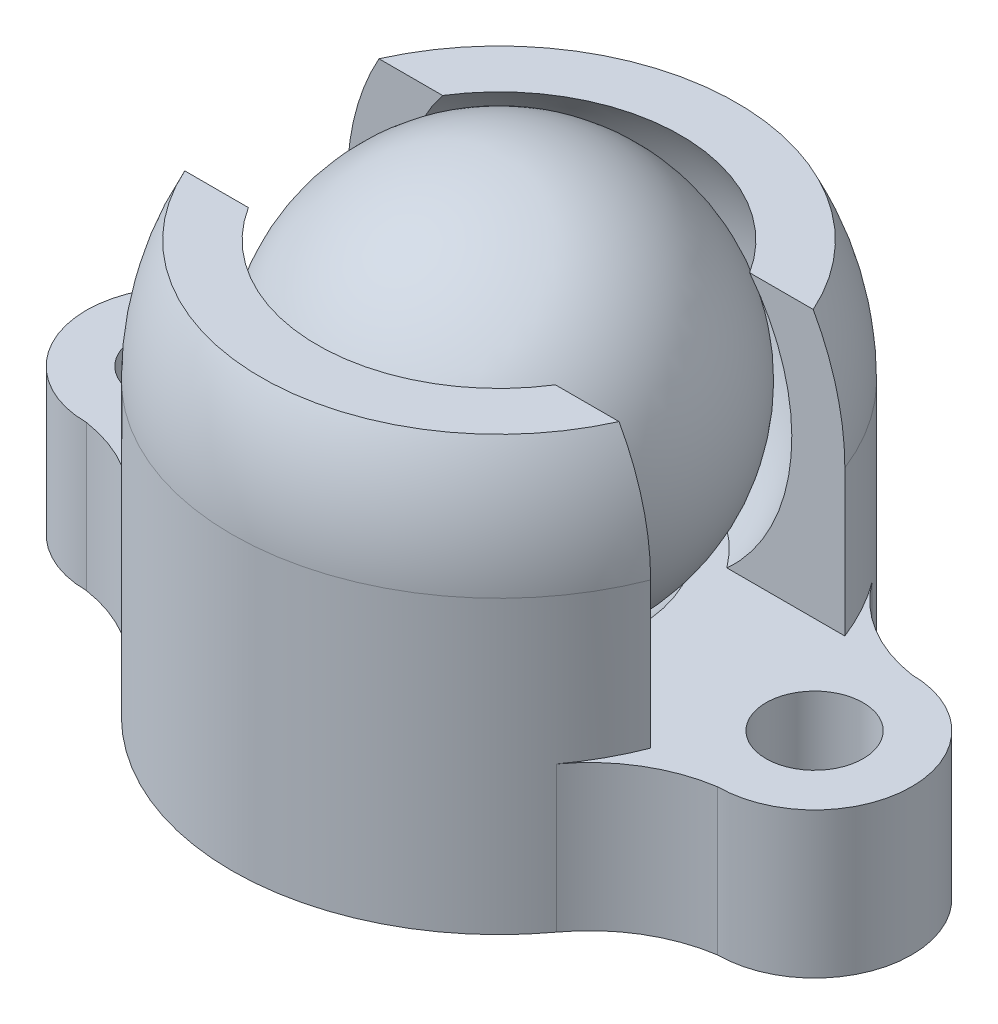
ISO-10303-21;
HEADER;
FILE_DESCRIPTION(('STEP AP214'),'2;1');
FILE_NAME('part.step','',(''),(''),'','','');
FILE_SCHEMA(('AUTOMOTIVE_DESIGN { 1 0 10303 214 1 1 1 1 }'));
ENDSEC;
DATA;
#1=APPLICATION_CONTEXT('core data for automotive mechanical design processes');
#2=APPLICATION_PROTOCOL_DEFINITION('international standard','automotive_design',2000,#1);
#3=PRODUCT_CONTEXT('',#1,'mechanical');
#4=PRODUCT('Part','Part','',(#3));
#5=PRODUCT_RELATED_PRODUCT_CATEGORY('part','',(#4));
#6=PRODUCT_DEFINITION_FORMATION('','',#4);
#7=PRODUCT_DEFINITION_CONTEXT('part definition',#1,'design');
#8=PRODUCT_DEFINITION('design','',#6,#7);
#9=PRODUCT_DEFINITION_SHAPE('','',#8);
#10=(LENGTH_UNIT() NAMED_UNIT(*) SI_UNIT(.MILLI.,.METRE.));
#11=(NAMED_UNIT(*) PLANE_ANGLE_UNIT() SI_UNIT($,.RADIAN.));
#12=(NAMED_UNIT(*) SI_UNIT($,.STERADIAN.) SOLID_ANGLE_UNIT());
#13=UNCERTAINTY_MEASURE_WITH_UNIT(LENGTH_MEASURE(1.E-05),#10,'distance_accuracy_value','');
#14=(GEOMETRIC_REPRESENTATION_CONTEXT(3) GLOBAL_UNCERTAINTY_ASSIGNED_CONTEXT((#13)) GLOBAL_UNIT_ASSIGNED_CONTEXT((#10,
#11,#12)) REPRESENTATION_CONTEXT('',''));
#15=CARTESIAN_POINT('',(0.,0.,0.));
#16=DIRECTION('',(0.,0.,1.));
#17=DIRECTION('',(1.,0.,0.));
#18=AXIS2_PLACEMENT_3D('',#15,#16,#17);
#19=CARTESIAN_POINT('',(0.,6.,0.));
#20=DIRECTION('',(0.,1.,0.));
#21=DIRECTION('',(0.,0.,-1.));
#22=AXIS2_PLACEMENT_3D('',#19,#20,#21);
#23=SPHERICAL_SURFACE('',#22,4.);
#24=CARTESIAN_POINT('',(0.,10.,0.));
#25=VERTEX_POINT('',#24);
#26=VERTEX_LOOP('',#25);
#27=FACE_BOUND('',#26,.T.);
#28=ADVANCED_FACE('F44',(#27),#23,.T.);
#29=CLOSED_SHELL('',(#28));
#30=MANIFOLD_SOLID_BREP('B2',#29);
#31=CARTESIAN_POINT('',(0.,6.,0.));
#32=DIRECTION('',(0.,1.,0.));
#33=DIRECTION('',(0.,0.,-1.));
#34=AXIS2_PLACEMENT_3D('',#31,#32,#33);
#35=SPHERICAL_SURFACE('',#34,4.5);
#36=CARTESIAN_POINT('',(0.,3.,0.));
#37=DIRECTION('',(0.,1.,0.));
#38=DIRECTION('',(0.,0.,1.));
#39=AXIS2_PLACEMENT_3D('',#36,#37,#38);
#40=CIRCLE('',#39,3.35410196624968);
#41=CARTESIAN_POINT('',(-2.69258240356725,3.,2.));
#42=VERTEX_POINT('',#41);
#43=CARTESIAN_POINT('',(2.69258240356725,3.,2.));
#44=VERTEX_POINT('',#43);
#45=EDGE_CURVE('E205',#42,#44,#40,.T.);
#46=ORIENTED_EDGE('',*,*,#45,.F.);
#47=CARTESIAN_POINT('',(0.,6.,2.));
#48=DIRECTION('',(0.,0.,1.));
#49=DIRECTION('',(1.,0.,0.));
#50=AXIS2_PLACEMENT_3D('',#47,#48,#49);
#51=CIRCLE('',#50,4.03112887414927);
#52=CARTESIAN_POINT('',(-3.16227766016838,8.5,2.));
#53=VERTEX_POINT('',#52);
#54=EDGE_CURVE('E314',#42,#53,#51,.F.);
#55=ORIENTED_EDGE('',*,*,#54,.T.);
#56=CARTESIAN_POINT('',(0.,8.5,0.));
#57=DIRECTION('',(0.,1.,0.));
#58=DIRECTION('',(0.,0.,1.));
#59=AXIS2_PLACEMENT_3D('',#56,#57,#58);
#60=CIRCLE('',#59,3.74165738677394);
#61=CARTESIAN_POINT('',(3.16227766016838,8.5,2.));
#62=VERTEX_POINT('',#61);
#63=EDGE_CURVE('E311',#53,#62,#60,.T.);
#64=ORIENTED_EDGE('',*,*,#63,.T.);
#65=EDGE_CURVE('E315',#62,#44,#51,.F.);
#66=ORIENTED_EDGE('',*,*,#65,.T.);
#67=EDGE_LOOP('',(#46,#55,#64,#66));
#68=FACE_BOUND('',#67,.T.);
#69=ADVANCED_FACE('F56',(#68),#35,.F.);
#70=CARTESIAN_POINT('',(0.,6.,0.));
#71=DIRECTION('',(0.,1.,0.));
#72=DIRECTION('',(0.,0.,-1.));
#73=AXIS2_PLACEMENT_3D('',#70,#71,#72);
#74=SPHERICAL_SURFACE('',#73,5.5);
#75=CARTESIAN_POINT('',(0.,6.,0.));
#76=DIRECTION('',(0.,1.,0.));
#77=DIRECTION('',(0.,0.,1.));
#78=AXIS2_PLACEMENT_3D('',#75,#76,#77);
#79=CIRCLE('',#78,5.5);
#80=CARTESIAN_POINT('',(-5.1234753829798,6.,2.));
#81=VERTEX_POINT('',#80);
#82=CARTESIAN_POINT('',(5.1234753829798,6.,2.));
#83=VERTEX_POINT('',#82);
#84=EDGE_CURVE('E293',#81,#83,#79,.T.);
#85=ORIENTED_EDGE('',*,*,#84,.T.);
#86=CARTESIAN_POINT('',(0.,6.,2.));
#87=DIRECTION('',(0.,0.,1.));
#88=DIRECTION('',(1.,0.,0.));
#89=AXIS2_PLACEMENT_3D('',#86,#87,#88);
#90=CIRCLE('',#89,5.1234753829798);
#91=CARTESIAN_POINT('',(4.47213595499958,8.5,2.));
#92=VERTEX_POINT('',#91);
#93=EDGE_CURVE('E301',#83,#92,#90,.T.);
#94=ORIENTED_EDGE('',*,*,#93,.T.);
#95=CARTESIAN_POINT('',(0.,8.5,0.));
#96=DIRECTION('',(0.,1.,0.));
#97=DIRECTION('',(0.,0.,1.));
#98=AXIS2_PLACEMENT_3D('',#95,#96,#97);
#99=CIRCLE('',#98,4.89897948556636);
#100=CARTESIAN_POINT('',(-4.47213595499958,8.5,2.));
#101=VERTEX_POINT('',#100);
#102=EDGE_CURVE('E308',#101,#92,#99,.T.);
#103=ORIENTED_EDGE('',*,*,#102,.F.);
#104=EDGE_CURVE('E303',#101,#81,#90,.T.);
#105=ORIENTED_EDGE('',*,*,#104,.T.);
#106=EDGE_LOOP('',(#85,#94,#103,#105));
#107=FACE_BOUND('',#106,.T.);
#108=ADVANCED_FACE('F299',(#107),#74,.T.);
#109=CARTESIAN_POINT('',(0.,8.5,-3.74165738677394));
#110=DIRECTION('',(0.,-1.,0.));
#111=DIRECTION('',(0.,0.,-1.));
#112=AXIS2_PLACEMENT_3D('',#109,#110,#111);
#113=PLANE('',#112);
#114=ORIENTED_EDGE('',*,*,#102,.T.);
#115=DIRECTION('',(1.,0.,0.));
#116=VECTOR('',#115,1.);
#117=CARTESIAN_POINT('',(-8.5,8.5,2.));
#118=LINE('',#117,#116);
#119=EDGE_CURVE('E328',#62,#92,#118,.T.);
#120=ORIENTED_EDGE('',*,*,#119,.F.);
#121=ORIENTED_EDGE('',*,*,#63,.F.);
#122=EDGE_CURVE('E322',#101,#53,#118,.T.);
#123=ORIENTED_EDGE('',*,*,#122,.F.);
#124=EDGE_LOOP('',(#114,#120,#121,#123));
#125=FACE_BOUND('',#124,.T.);
#126=ADVANCED_FACE('F381',(#125),#113,.F.);
#127=CARTESIAN_POINT('',(0.,3.,0.));
#128=DIRECTION('',(0.,-1.,0.));
#129=DIRECTION('',(0.,0.,-1.));
#130=AXIS2_PLACEMENT_3D('',#127,#128,#129);
#131=CYLINDRICAL_SURFACE('',#130,5.5);
#132=ORIENTED_EDGE('',*,*,#84,.F.);
#133=DIRECTION('',(0.,-1.,0.));
#134=VECTOR('',#133,1.);
#135=CARTESIAN_POINT('',(-5.1234753829798,3.,2.));
#136=LINE('',#135,#134);
#137=CARTESIAN_POINT('',(-5.1234753829798,3.,2.));
#138=VERTEX_POINT('',#137);
#139=EDGE_CURVE('E42',#81,#138,#136,.T.);
#140=ORIENTED_EDGE('',*,*,#139,.T.);
#141=CARTESIAN_POINT('',(0.,3.,0.));
#142=DIRECTION('',(0.,1.,0.));
#143=DIRECTION('',(0.,0.,1.));
#144=AXIS2_PLACEMENT_3D('',#141,#142,#143);
#145=CIRCLE('',#144,5.5);
#146=CARTESIAN_POINT('',(-4.43705983732471,3.,3.25));
#147=VERTEX_POINT('',#146);
#148=EDGE_CURVE('E280',#147,#138,#145,.F.);
#149=ORIENTED_EDGE('',*,*,#148,.F.);
#150=DIRECTION('',(0.,-1.,0.));
#151=VECTOR('',#150,1.);
#152=CARTESIAN_POINT('',(-4.43705983732471,3.,3.25));
#153=LINE('',#152,#151);
#154=CARTESIAN_POINT('',(-4.43705983732471,0.,3.25));
#155=VERTEX_POINT('',#154);
#156=EDGE_CURVE('E266',#147,#155,#153,.T.);
#157=ORIENTED_EDGE('',*,*,#156,.T.);
#158=CARTESIAN_POINT('',(0.,0.,0.));
#159=DIRECTION('',(0.,1.,0.));
#160=DIRECTION('',(0.,0.,1.));
#161=AXIS2_PLACEMENT_3D('',#158,#159,#160);
#162=CIRCLE('',#161,5.5);
#163=CARTESIAN_POINT('',(4.43705983732471,0.,3.25));
#164=VERTEX_POINT('',#163);
#165=EDGE_CURVE('E253',#155,#164,#162,.T.);
#166=ORIENTED_EDGE('',*,*,#165,.T.);
#167=DIRECTION('',(0.,-1.,0.));
#168=VECTOR('',#167,1.);
#169=CARTESIAN_POINT('',(4.43705983732471,3.,3.25));
#170=LINE('',#169,#168);
#171=CARTESIAN_POINT('',(4.43705983732471,3.,3.25));
#172=VERTEX_POINT('',#171);
#173=EDGE_CURVE('E264',#172,#164,#170,.T.);
#174=ORIENTED_EDGE('',*,*,#173,.F.);
#175=CARTESIAN_POINT('',(0.,3.,0.));
#176=DIRECTION('',(0.,1.,0.));
#177=DIRECTION('',(0.,0.,1.));
#178=AXIS2_PLACEMENT_3D('',#175,#176,#177);
#179=CIRCLE('',#178,5.5);
#180=CARTESIAN_POINT('',(5.1234753829798,3.,2.));
#181=VERTEX_POINT('',#180);
#182=EDGE_CURVE('E210',#172,#181,#179,.T.);
#183=ORIENTED_EDGE('',*,*,#182,.T.);
#184=DIRECTION('',(0.,-1.,0.));
#185=VECTOR('',#184,1.);
#186=CARTESIAN_POINT('',(5.1234753829798,3.,2.));
#187=LINE('',#186,#185);
#188=EDGE_CURVE('E64',#181,#83,#187,.F.);
#189=ORIENTED_EDGE('',*,*,#188,.T.);
#190=EDGE_LOOP('',(#132,#140,#149,#157,#166,#174,#183,#189));
#191=FACE_BOUND('',#190,.T.);
#192=ADVANCED_FACE('F292',(#191),#131,.T.);
#193=CARTESIAN_POINT('',(0.,6.5,0.));
#194=DIRECTION('',(0.,-1.,0.));
#195=DIRECTION('',(-1.,0.,0.));
#196=AXIS2_PLACEMENT_3D('',#193,#194,#195);
#197=SPHERICAL_SURFACE('',#196,4.5);
#198=CARTESIAN_POINT('',(0.,3.,0.));
#199=DIRECTION('',(0.,1.,0.));
#200=DIRECTION('',(0.,0.,1.));
#201=AXIS2_PLACEMENT_3D('',#198,#199,#200);
#202=CIRCLE('',#201,2.82842712474619);
#203=CARTESIAN_POINT('',(0.,3.,2.82842712474619));
#204=VERTEX_POINT('',#203);
#205=EDGE_CURVE('E204',#204,#204,#202,.T.);
#206=ORIENTED_EDGE('',*,*,#205,.T.);
#207=EDGE_LOOP('',(#206));
#208=FACE_BOUND('',#207,.T.);
#209=ADVANCED_FACE('F401',(#208),#197,.F.);
#210=CARTESIAN_POINT('',(2.69258240356725,3.,-2.));
#211=VERTEX_POINT('',#210);
#212=CARTESIAN_POINT('',(-2.69258240356725,3.,-2.));
#213=VERTEX_POINT('',#212);
#214=EDGE_CURVE('E194',#211,#213,#40,.T.);
#215=ORIENTED_EDGE('',*,*,#214,.F.);
#216=CARTESIAN_POINT('',(0.,6.,-2.));
#217=DIRECTION('',(0.,0.,-1.));
#218=DIRECTION('',(-1.,0.,0.));
#219=AXIS2_PLACEMENT_3D('',#216,#217,#218);
#220=CIRCLE('',#219,4.03112887414927);
#221=CARTESIAN_POINT('',(3.16227766016838,8.5,-2.));
#222=VERTEX_POINT('',#221);
#223=EDGE_CURVE('E197',#211,#222,#220,.F.);
#224=ORIENTED_EDGE('',*,*,#223,.T.);
#225=CARTESIAN_POINT('',(-3.16227766016838,8.5,-2.));
#226=VERTEX_POINT('',#225);
#227=EDGE_CURVE('E196',#222,#226,#60,.T.);
#228=ORIENTED_EDGE('',*,*,#227,.T.);
#229=EDGE_CURVE('E181',#226,#213,#220,.F.);
#230=ORIENTED_EDGE('',*,*,#229,.T.);
#231=EDGE_LOOP('',(#215,#224,#228,#230));
#232=FACE_BOUND('',#231,.T.);
#233=ADVANCED_FACE('F192',(#232),#35,.F.);
#234=CARTESIAN_POINT('',(5.1234753829798,6.,-2.));
#235=VERTEX_POINT('',#234);
#236=CARTESIAN_POINT('',(-5.1234753829798,6.,-2.));
#237=VERTEX_POINT('',#236);
#238=EDGE_CURVE('E304',#235,#237,#79,.T.);
#239=ORIENTED_EDGE('',*,*,#238,.T.);
#240=CARTESIAN_POINT('',(0.,6.,-2.));
#241=DIRECTION('',(0.,0.,-1.));
#242=DIRECTION('',(-1.,0.,0.));
#243=AXIS2_PLACEMENT_3D('',#240,#241,#242);
#244=CIRCLE('',#243,5.1234753829798);
#245=CARTESIAN_POINT('',(-4.47213595499958,8.5,-2.));
#246=VERTEX_POINT('',#245);
#247=EDGE_CURVE('E319',#237,#246,#244,.T.);
#248=ORIENTED_EDGE('',*,*,#247,.T.);
#249=CARTESIAN_POINT('',(4.47213595499958,8.5,-2.));
#250=VERTEX_POINT('',#249);
#251=EDGE_CURVE('E305',#250,#246,#99,.T.);
#252=ORIENTED_EDGE('',*,*,#251,.F.);
#253=EDGE_CURVE('E198',#250,#235,#244,.T.);
#254=ORIENTED_EDGE('',*,*,#253,.T.);
#255=EDGE_LOOP('',(#239,#248,#252,#254));
#256=FACE_BOUND('',#255,.T.);
#257=ADVANCED_FACE('F334',(#256),#74,.T.);
#258=ORIENTED_EDGE('',*,*,#251,.T.);
#259=DIRECTION('',(1.,0.,0.));
#260=VECTOR('',#259,1.);
#261=CARTESIAN_POINT('',(-8.5,8.5,-2.));
#262=LINE('',#261,#260);
#263=EDGE_CURVE('E327',#246,#226,#262,.T.);
#264=ORIENTED_EDGE('',*,*,#263,.T.);
#265=ORIENTED_EDGE('',*,*,#227,.F.);
#266=EDGE_CURVE('E186',#222,#250,#262,.T.);
#267=ORIENTED_EDGE('',*,*,#266,.T.);
#268=EDGE_LOOP('',(#258,#264,#265,#267));
#269=FACE_BOUND('',#268,.T.);
#270=ADVANCED_FACE('F331',(#269),#113,.F.);
#271=CARTESIAN_POINT('',(-6.5,3.,0.));
#272=DIRECTION('',(0.,-1.,0.));
#273=DIRECTION('',(0.,0.,-1.));
#274=AXIS2_PLACEMENT_3D('',#271,#272,#273);
#275=CYLINDRICAL_SURFACE('',#274,2.);
#276=CARTESIAN_POINT('',(-6.5,0.,0.));
#277=DIRECTION('',(0.,1.,0.));
#278=DIRECTION('',(0.,0.,1.));
#279=AXIS2_PLACEMENT_3D('',#276,#277,#278);
#280=CIRCLE('',#279,2.);
#281=CARTESIAN_POINT('',(-6.5,0.,-2.));
#282=VERTEX_POINT('',#281);
#283=CARTESIAN_POINT('',(-6.5,0.,2.));
#284=VERTEX_POINT('',#283);
#285=EDGE_CURVE('E249',#282,#284,#280,.T.);
#286=ORIENTED_EDGE('',*,*,#285,.T.);
#287=DIRECTION('',(0.,-1.,0.));
#288=VECTOR('',#287,1.);
#289=CARTESIAN_POINT('',(-6.5,3.,2.));
#290=LINE('',#289,#288);
#291=CARTESIAN_POINT('',(-6.5,3.,2.));
#292=VERTEX_POINT('',#291);
#293=EDGE_CURVE('E269',#292,#284,#290,.T.);
#294=ORIENTED_EDGE('',*,*,#293,.F.);
#295=CARTESIAN_POINT('',(-6.5,3.,0.));
#296=DIRECTION('',(0.,1.,0.));
#297=DIRECTION('',(0.,0.,1.));
#298=AXIS2_PLACEMENT_3D('',#295,#296,#297);
#299=CIRCLE('',#298,2.);
#300=CARTESIAN_POINT('',(-6.5,3.,-2.));
#301=VERTEX_POINT('',#300);
#302=EDGE_CURVE('E226',#301,#292,#299,.T.);
#303=ORIENTED_EDGE('',*,*,#302,.F.);
#304=DIRECTION('',(0.,-1.,0.));
#305=VECTOR('',#304,1.);
#306=CARTESIAN_POINT('',(-6.5,3.,-2.));
#307=LINE('',#306,#305);
#308=EDGE_CURVE('E272',#301,#282,#307,.T.);
#309=ORIENTED_EDGE('',*,*,#308,.T.);
#310=EDGE_LOOP('',(#286,#294,#303,#309));
#311=FACE_BOUND('',#310,.T.);
#312=ADVANCED_FACE('F369',(#311),#275,.T.);
#313=CARTESIAN_POINT('',(-6.5,3.,0.));
#314=DIRECTION('',(0.,-1.,0.));
#315=DIRECTION('',(0.,0.,-1.));
#316=AXIS2_PLACEMENT_3D('',#313,#314,#315);
#317=CYLINDRICAL_SURFACE('',#316,1.);
#318=CARTESIAN_POINT('',(-6.5,3.,0.));
#319=DIRECTION('',(0.,1.,0.));
#320=DIRECTION('',(0.,0.,1.));
#321=AXIS2_PLACEMENT_3D('',#318,#319,#320);
#322=CIRCLE('',#321,1.);
#323=CARTESIAN_POINT('',(-6.5,3.,1.));
#324=VERTEX_POINT('',#323);
#325=EDGE_CURVE('E217',#324,#324,#322,.T.);
#326=ORIENTED_EDGE('',*,*,#325,.T.);
#327=EDGE_LOOP('',(#326));
#328=FACE_BOUND('',#327,.T.);
#329=CARTESIAN_POINT('',(-6.5,0.,0.));
#330=DIRECTION('',(0.,1.,0.));
#331=DIRECTION('',(0.,0.,1.));
#332=AXIS2_PLACEMENT_3D('',#329,#330,#331);
#333=CIRCLE('',#332,1.);
#334=CARTESIAN_POINT('',(-6.5,0.,1.));
#335=VERTEX_POINT('',#334);
#336=EDGE_CURVE('E237',#335,#335,#333,.T.);
#337=ORIENTED_EDGE('',*,*,#336,.F.);
#338=EDGE_LOOP('',(#337));
#339=FACE_BOUND('',#338,.T.);
#340=ADVANCED_FACE('F427',(#328,#339),#317,.F.);
#341=CARTESIAN_POINT('',(-6.97255019678251,3.,-5.10716306976971));
#342=DIRECTION('',(0.,-1.,0.));
#343=DIRECTION('',(0.,0.,-1.));
#344=AXIS2_PLACEMENT_3D('',#341,#342,#343);
#345=CYLINDRICAL_SURFACE('',#344,3.14289134884105);
#346=CARTESIAN_POINT('',(-6.97255019678251,0.,-5.10716306976971));
#347=DIRECTION('',(0.,1.,0.));
#348=DIRECTION('',(0.,0.,1.));
#349=AXIS2_PLACEMENT_3D('',#346,#347,#348);
#350=CIRCLE('',#349,3.14289134884105);
#351=CARTESIAN_POINT('',(-4.43705983732471,0.,-3.25));
#352=VERTEX_POINT('',#351);
#353=EDGE_CURVE('E246',#282,#352,#350,.T.);
#354=ORIENTED_EDGE('',*,*,#353,.F.);
#355=ORIENTED_EDGE('',*,*,#308,.F.);
#356=CARTESIAN_POINT('',(-6.97255019678251,3.,-5.10716306976971));
#357=DIRECTION('',(0.,1.,0.));
#358=DIRECTION('',(0.,0.,1.));
#359=AXIS2_PLACEMENT_3D('',#356,#357,#358);
#360=CIRCLE('',#359,3.14289134884105);
#361=CARTESIAN_POINT('',(-4.43705983732471,3.,-3.25));
#362=VERTEX_POINT('',#361);
#363=EDGE_CURVE('E223',#301,#362,#360,.T.);
#364=ORIENTED_EDGE('',*,*,#363,.T.);
#365=DIRECTION('',(0.,-1.,0.));
#366=VECTOR('',#365,1.);
#367=CARTESIAN_POINT('',(-4.43705983732471,3.,-3.25));
#368=LINE('',#367,#366);
#369=EDGE_CURVE('E274',#362,#352,#368,.T.);
#370=ORIENTED_EDGE('',*,*,#369,.T.);
#371=EDGE_LOOP('',(#354,#355,#364,#370));
#372=FACE_BOUND('',#371,.T.);
#373=ADVANCED_FACE('F372',(#372),#345,.F.);
#374=CARTESIAN_POINT('',(6.5,3.,0.));
#375=DIRECTION('',(0.,-1.,0.));
#376=DIRECTION('',(0.,0.,-1.));
#377=AXIS2_PLACEMENT_3D('',#374,#375,#376);
#378=CYLINDRICAL_SURFACE('',#377,2.);
#379=CARTESIAN_POINT('',(6.5,0.,0.));
#380=DIRECTION('',(0.,1.,0.));
#381=DIRECTION('',(0.,0.,1.));
#382=AXIS2_PLACEMENT_3D('',#379,#380,#381);
#383=CIRCLE('',#382,2.);
#384=CARTESIAN_POINT('',(6.5,0.,-2.));
#385=VERTEX_POINT('',#384);
#386=CARTESIAN_POINT('',(6.5,0.,2.));
#387=VERTEX_POINT('',#386);
#388=EDGE_CURVE('E218',#385,#387,#383,.F.);
#389=ORIENTED_EDGE('',*,*,#388,.F.);
#390=DIRECTION('',(0.,-1.,0.));
#391=VECTOR('',#390,1.);
#392=CARTESIAN_POINT('',(6.5,3.,-2.));
#393=LINE('',#392,#391);
#394=CARTESIAN_POINT('',(6.5,3.,-2.));
#395=VERTEX_POINT('',#394);
#396=EDGE_CURVE('E234',#395,#385,#393,.T.);
#397=ORIENTED_EDGE('',*,*,#396,.F.);
#398=CARTESIAN_POINT('',(6.5,3.,0.));
#399=DIRECTION('',(0.,1.,0.));
#400=DIRECTION('',(0.,0.,1.));
#401=AXIS2_PLACEMENT_3D('',#398,#399,#400);
#402=CIRCLE('',#401,2.);
#403=CARTESIAN_POINT('',(6.5,3.,2.));
#404=VERTEX_POINT('',#403);
#405=EDGE_CURVE('E232',#395,#404,#402,.F.);
#406=ORIENTED_EDGE('',*,*,#405,.T.);
#407=DIRECTION('',(0.,-1.,0.));
#408=VECTOR('',#407,1.);
#409=CARTESIAN_POINT('',(6.5,3.,2.));
#410=LINE('',#409,#408);
#411=EDGE_CURVE('E262',#404,#387,#410,.T.);
#412=ORIENTED_EDGE('',*,*,#411,.T.);
#413=EDGE_LOOP('',(#389,#397,#406,#412));
#414=FACE_BOUND('',#413,.T.);
#415=ADVANCED_FACE('F352',(#414),#378,.T.);
#416=CARTESIAN_POINT('',(6.5,3.,0.));
#417=DIRECTION('',(0.,-1.,0.));
#418=DIRECTION('',(0.,0.,-1.));
#419=AXIS2_PLACEMENT_3D('',#416,#417,#418);
#420=CYLINDRICAL_SURFACE('',#419,1.);
#421=CARTESIAN_POINT('',(6.5,3.,0.));
#422=DIRECTION('',(0.,1.,0.));
#423=DIRECTION('',(0.,0.,1.));
#424=AXIS2_PLACEMENT_3D('',#421,#422,#423);
#425=CIRCLE('',#424,1.);
#426=CARTESIAN_POINT('',(6.5,3.,1.));
#427=VERTEX_POINT('',#426);
#428=EDGE_CURVE('E214',#427,#427,#425,.F.);
#429=ORIENTED_EDGE('',*,*,#428,.F.);
#430=EDGE_LOOP('',(#429));
#431=FACE_BOUND('',#430,.T.);
#432=CARTESIAN_POINT('',(6.5,0.,0.));
#433=DIRECTION('',(0.,1.,0.));
#434=DIRECTION('',(0.,0.,1.));
#435=AXIS2_PLACEMENT_3D('',#432,#433,#434);
#436=CIRCLE('',#435,1.);
#437=CARTESIAN_POINT('',(6.5,0.,1.));
#438=VERTEX_POINT('',#437);
#439=EDGE_CURVE('E208',#438,#438,#436,.F.);
#440=ORIENTED_EDGE('',*,*,#439,.T.);
#441=EDGE_LOOP('',(#440));
#442=FACE_BOUND('',#441,.T.);
#443=ADVANCED_FACE('F58',(#431,#442),#420,.F.);
#444=CARTESIAN_POINT('',(6.97255019678251,3.,-5.10716306976971));
#445=DIRECTION('',(0.,-1.,0.));
#446=DIRECTION('',(0.,0.,-1.));
#447=AXIS2_PLACEMENT_3D('',#444,#445,#446);
#448=CYLINDRICAL_SURFACE('',#447,3.14289134884105);
#449=CARTESIAN_POINT('',(6.97255019678251,0.,-5.10716306976971));
#450=DIRECTION('',(0.,1.,0.));
#451=DIRECTION('',(0.,0.,1.));
#452=AXIS2_PLACEMENT_3D('',#449,#450,#451);
#453=CIRCLE('',#452,3.14289134884105);
#454=CARTESIAN_POINT('',(4.43705983732471,0.,-3.25));
#455=VERTEX_POINT('',#454);
#456=EDGE_CURVE('E240',#385,#455,#453,.F.);
#457=ORIENTED_EDGE('',*,*,#456,.T.);
#458=DIRECTION('',(0.,-1.,0.));
#459=VECTOR('',#458,1.);
#460=CARTESIAN_POINT('',(4.43705983732471,3.,-3.25));
#461=LINE('',#460,#459);
#462=CARTESIAN_POINT('',(4.43705983732471,3.,-3.25));
#463=VERTEX_POINT('',#462);
#464=EDGE_CURVE('E276',#463,#455,#461,.T.);
#465=ORIENTED_EDGE('',*,*,#464,.F.);
#466=CARTESIAN_POINT('',(6.97255019678251,3.,-5.10716306976971));
#467=DIRECTION('',(0.,1.,0.));
#468=DIRECTION('',(0.,0.,1.));
#469=AXIS2_PLACEMENT_3D('',#466,#467,#468);
#470=CIRCLE('',#469,3.14289134884105);
#471=EDGE_CURVE('E221',#395,#463,#470,.F.);
#472=ORIENTED_EDGE('',*,*,#471,.F.);
#473=ORIENTED_EDGE('',*,*,#396,.T.);
#474=EDGE_LOOP('',(#457,#465,#472,#473));
#475=FACE_BOUND('',#474,.T.);
#476=ADVANCED_FACE('F347',(#475),#448,.F.);
#477=CARTESIAN_POINT('',(-6.97255019678251,3.,5.10716306976971));
#478=DIRECTION('',(0.,-1.,0.));
#479=DIRECTION('',(0.,0.,-1.));
#480=AXIS2_PLACEMENT_3D('',#477,#478,#479);
#481=CYLINDRICAL_SURFACE('',#480,3.14289134884105);
#482=CARTESIAN_POINT('',(-6.97255019678251,0.,5.10716306976971));
#483=DIRECTION('',(0.,1.,0.));
#484=DIRECTION('',(0.,0.,1.));
#485=AXIS2_PLACEMENT_3D('',#482,#483,#484);
#486=CIRCLE('',#485,3.14289134884105);
#487=EDGE_CURVE('E251',#284,#155,#486,.F.);
#488=ORIENTED_EDGE('',*,*,#487,.T.);
#489=ORIENTED_EDGE('',*,*,#156,.F.);
#490=CARTESIAN_POINT('',(-6.97255019678251,3.,5.10716306976971));
#491=DIRECTION('',(0.,1.,0.));
#492=DIRECTION('',(0.,0.,1.));
#493=AXIS2_PLACEMENT_3D('',#490,#491,#492);
#494=CIRCLE('',#493,3.14289134884105);
#495=EDGE_CURVE('E228',#292,#147,#494,.F.);
#496=ORIENTED_EDGE('',*,*,#495,.F.);
#497=ORIENTED_EDGE('',*,*,#293,.T.);
#498=EDGE_LOOP('',(#488,#489,#496,#497));
#499=FACE_BOUND('',#498,.T.);
#500=ADVANCED_FACE('F365',(#499),#481,.F.);
#501=CARTESIAN_POINT('',(0.,3.,0.));
#502=DIRECTION('',(0.,1.,0.));
#503=DIRECTION('',(0.,0.,1.));
#504=AXIS2_PLACEMENT_3D('',#501,#502,#503);
#505=PLANE('',#504);
#506=ORIENTED_EDGE('',*,*,#205,.F.);
#507=EDGE_LOOP('',(#506));
#508=FACE_BOUND('',#507,.T.);
#509=CARTESIAN_POINT('',(5.1234753829798,3.,-2.));
#510=VERTEX_POINT('',#509);
#511=EDGE_CURVE('E278',#463,#510,#145,.F.);
#512=ORIENTED_EDGE('',*,*,#511,.T.);
#513=DIRECTION('',(1.,0.,0.));
#514=VECTOR('',#513,1.);
#515=CARTESIAN_POINT('',(-8.5,3.,-2.));
#516=LINE('',#515,#514);
#517=EDGE_CURVE('E187',#211,#510,#516,.T.);
#518=ORIENTED_EDGE('',*,*,#517,.F.);
#519=ORIENTED_EDGE('',*,*,#214,.T.);
#520=CARTESIAN_POINT('',(-5.1234753829798,3.,-2.));
#521=VERTEX_POINT('',#520);
#522=EDGE_CURVE('E71',#521,#213,#516,.T.);
#523=ORIENTED_EDGE('',*,*,#522,.F.);
#524=EDGE_CURVE('E283',#521,#362,#145,.F.);
#525=ORIENTED_EDGE('',*,*,#524,.T.);
#526=ORIENTED_EDGE('',*,*,#363,.F.);
#527=ORIENTED_EDGE('',*,*,#302,.T.);
#528=ORIENTED_EDGE('',*,*,#495,.T.);
#529=ORIENTED_EDGE('',*,*,#148,.T.);
#530=DIRECTION('',(1.,0.,0.));
#531=VECTOR('',#530,1.);
#532=CARTESIAN_POINT('',(-8.5,3.,2.));
#533=LINE('',#532,#531);
#534=EDGE_CURVE('E323',#138,#42,#533,.T.);
#535=ORIENTED_EDGE('',*,*,#534,.T.);
#536=ORIENTED_EDGE('',*,*,#45,.T.);
#537=EDGE_CURVE('E78',#44,#181,#533,.T.);
#538=ORIENTED_EDGE('',*,*,#537,.T.);
#539=ORIENTED_EDGE('',*,*,#182,.F.);
#540=CARTESIAN_POINT('',(6.97255019678252,3.,5.10716306976971));
#541=DIRECTION('',(0.,1.,0.));
#542=DIRECTION('',(0.,0.,1.));
#543=AXIS2_PLACEMENT_3D('',#540,#541,#542);
#544=CIRCLE('',#543,3.14289134884105);
#545=EDGE_CURVE('E230',#404,#172,#544,.T.);
#546=ORIENTED_EDGE('',*,*,#545,.F.);
#547=ORIENTED_EDGE('',*,*,#405,.F.);
#548=ORIENTED_EDGE('',*,*,#471,.T.);
#549=EDGE_LOOP('',(#512,#518,#519,#523,#525,#526,#527,#528,#529,#535,#536,#538,#539,#546,#547,#548));
#550=FACE_BOUND('',#549,.T.);
#551=ORIENTED_EDGE('',*,*,#428,.T.);
#552=EDGE_LOOP('',(#551));
#553=FACE_BOUND('',#552,.T.);
#554=ORIENTED_EDGE('',*,*,#325,.F.);
#555=EDGE_LOOP('',(#554));
#556=FACE_BOUND('',#555,.T.);
#557=ADVANCED_FACE('F202',(#508,#550,#553,#556),#505,.T.);
#558=CARTESIAN_POINT('',(6.97255019678252,3.,5.10716306976971));
#559=DIRECTION('',(0.,-1.,0.));
#560=DIRECTION('',(0.,0.,-1.));
#561=AXIS2_PLACEMENT_3D('',#558,#559,#560);
#562=CYLINDRICAL_SURFACE('',#561,3.14289134884105);
#563=CARTESIAN_POINT('',(6.97255019678252,0.,5.10716306976971));
#564=DIRECTION('',(0.,1.,0.));
#565=DIRECTION('',(0.,0.,1.));
#566=AXIS2_PLACEMENT_3D('',#563,#564,#565);
#567=CIRCLE('',#566,3.14289134884105);
#568=EDGE_CURVE('E256',#387,#164,#567,.T.);
#569=ORIENTED_EDGE('',*,*,#568,.F.);
#570=ORIENTED_EDGE('',*,*,#411,.F.);
#571=ORIENTED_EDGE('',*,*,#545,.T.);
#572=ORIENTED_EDGE('',*,*,#173,.T.);
#573=EDGE_LOOP('',(#569,#570,#571,#572));
#574=FACE_BOUND('',#573,.T.);
#575=ADVANCED_FACE('F357',(#574),#562,.F.);
#576=CARTESIAN_POINT('',(0.,0.,0.));
#577=DIRECTION('',(0.,1.,0.));
#578=DIRECTION('',(0.,0.,1.));
#579=AXIS2_PLACEMENT_3D('',#576,#577,#578);
#580=PLANE('',#579);
#581=ORIENTED_EDGE('',*,*,#439,.F.);
#582=EDGE_LOOP('',(#581));
#583=FACE_BOUND('',#582,.T.);
#584=ORIENTED_EDGE('',*,*,#336,.T.);
#585=EDGE_LOOP('',(#584));
#586=FACE_BOUND('',#585,.T.);
#587=ORIENTED_EDGE('',*,*,#456,.F.);
#588=ORIENTED_EDGE('',*,*,#388,.T.);
#589=ORIENTED_EDGE('',*,*,#568,.T.);
#590=ORIENTED_EDGE('',*,*,#165,.F.);
#591=ORIENTED_EDGE('',*,*,#487,.F.);
#592=ORIENTED_EDGE('',*,*,#285,.F.);
#593=ORIENTED_EDGE('',*,*,#353,.T.);
#594=CARTESIAN_POINT('',(0.,0.,0.));
#595=DIRECTION('',(0.,1.,0.));
#596=DIRECTION('',(0.,0.,1.));
#597=AXIS2_PLACEMENT_3D('',#594,#595,#596);
#598=CIRCLE('',#597,5.5);
#599=EDGE_CURVE('E243',#455,#352,#598,.T.);
#600=ORIENTED_EDGE('',*,*,#599,.F.);
#601=EDGE_LOOP('',(#587,#588,#589,#590,#591,#592,#593,#600));
#602=FACE_BOUND('',#601,.T.);
#603=ADVANCED_FACE('F350',(#583,#586,#602),#580,.F.);
#604=ORIENTED_EDGE('',*,*,#238,.F.);
#605=DIRECTION('',(0.,-1.,0.));
#606=VECTOR('',#605,1.);
#607=CARTESIAN_POINT('',(5.1234753829798,3.,-2.));
#608=LINE('',#607,#606);
#609=EDGE_CURVE('E285',#235,#510,#608,.T.);
#610=ORIENTED_EDGE('',*,*,#609,.T.);
#611=ORIENTED_EDGE('',*,*,#511,.F.);
#612=ORIENTED_EDGE('',*,*,#464,.T.);
#613=ORIENTED_EDGE('',*,*,#599,.T.);
#614=ORIENTED_EDGE('',*,*,#369,.F.);
#615=ORIENTED_EDGE('',*,*,#524,.F.);
#616=DIRECTION('',(0.,-1.,0.));
#617=VECTOR('',#616,1.);
#618=CARTESIAN_POINT('',(-5.1234753829798,3.,-2.));
#619=LINE('',#618,#617);
#620=EDGE_CURVE('E184',#521,#237,#619,.F.);
#621=ORIENTED_EDGE('',*,*,#620,.T.);
#622=EDGE_LOOP('',(#604,#610,#611,#612,#613,#614,#615,#621));
#623=FACE_BOUND('',#622,.T.);
#624=ADVANCED_FACE('F338',(#623),#131,.T.);
#625=CARTESIAN_POINT('',(-8.5,3.,-2.));
#626=DIRECTION('',(0.,0.,-1.));
#627=DIRECTION('',(-1.,0.,0.));
#628=AXIS2_PLACEMENT_3D('',#625,#626,#627);
#629=PLANE('',#628);
#630=ORIENTED_EDGE('',*,*,#263,.F.);
#631=ORIENTED_EDGE('',*,*,#247,.F.);
#632=ORIENTED_EDGE('',*,*,#620,.F.);
#633=ORIENTED_EDGE('',*,*,#522,.T.);
#634=ORIENTED_EDGE('',*,*,#229,.F.);
#635=EDGE_LOOP('',(#630,#631,#632,#633,#634));
#636=FACE_BOUND('',#635,.T.);
#637=ADVANCED_FACE('F180',(#636),#629,.F.);
#638=CARTESIAN_POINT('',(-8.5,3.,2.));
#639=DIRECTION('',(0.,0.,1.));
#640=DIRECTION('',(1.,0.,0.));
#641=AXIS2_PLACEMENT_3D('',#638,#639,#640);
#642=PLANE('',#641);
#643=ORIENTED_EDGE('',*,*,#534,.F.);
#644=ORIENTED_EDGE('',*,*,#139,.F.);
#645=ORIENTED_EDGE('',*,*,#104,.F.);
#646=ORIENTED_EDGE('',*,*,#122,.T.);
#647=ORIENTED_EDGE('',*,*,#54,.F.);
#648=EDGE_LOOP('',(#643,#644,#645,#646,#647));
#649=FACE_BOUND('',#648,.T.);
#650=ADVANCED_FACE('F383',(#649),#642,.F.);
#651=ORIENTED_EDGE('',*,*,#119,.T.);
#652=ORIENTED_EDGE('',*,*,#93,.F.);
#653=ORIENTED_EDGE('',*,*,#188,.F.);
#654=ORIENTED_EDGE('',*,*,#537,.F.);
#655=ORIENTED_EDGE('',*,*,#65,.F.);
#656=EDGE_LOOP('',(#651,#652,#653,#654,#655));
#657=FACE_BOUND('',#656,.T.);
#658=ADVANCED_FACE('F379',(#657),#642,.F.);
#659=ORIENTED_EDGE('',*,*,#517,.T.);
#660=ORIENTED_EDGE('',*,*,#609,.F.);
#661=ORIENTED_EDGE('',*,*,#253,.F.);
#662=ORIENTED_EDGE('',*,*,#266,.F.);
#663=ORIENTED_EDGE('',*,*,#223,.F.);
#664=EDGE_LOOP('',(#659,#660,#661,#662,#663));
#665=FACE_BOUND('',#664,.T.);
#666=ADVANCED_FACE('F390',(#665),#629,.F.);
#667=CLOSED_SHELL('',(#69,#108,#126,#192,#209,#233,#257,#270,#312,#340,#373,#415,#443,#476,#500,
#557,#575,#603,#624,#637,#650,#658,#666));
#668=MANIFOLD_SOLID_BREP('B6',#667);
#669=ADVANCED_BREP_SHAPE_REPRESENTATION('',(#18,#30,#668),#14);
#670=SHAPE_DEFINITION_REPRESENTATION(#9,#669);
ENDSEC;
END-ISO-10303-21;
